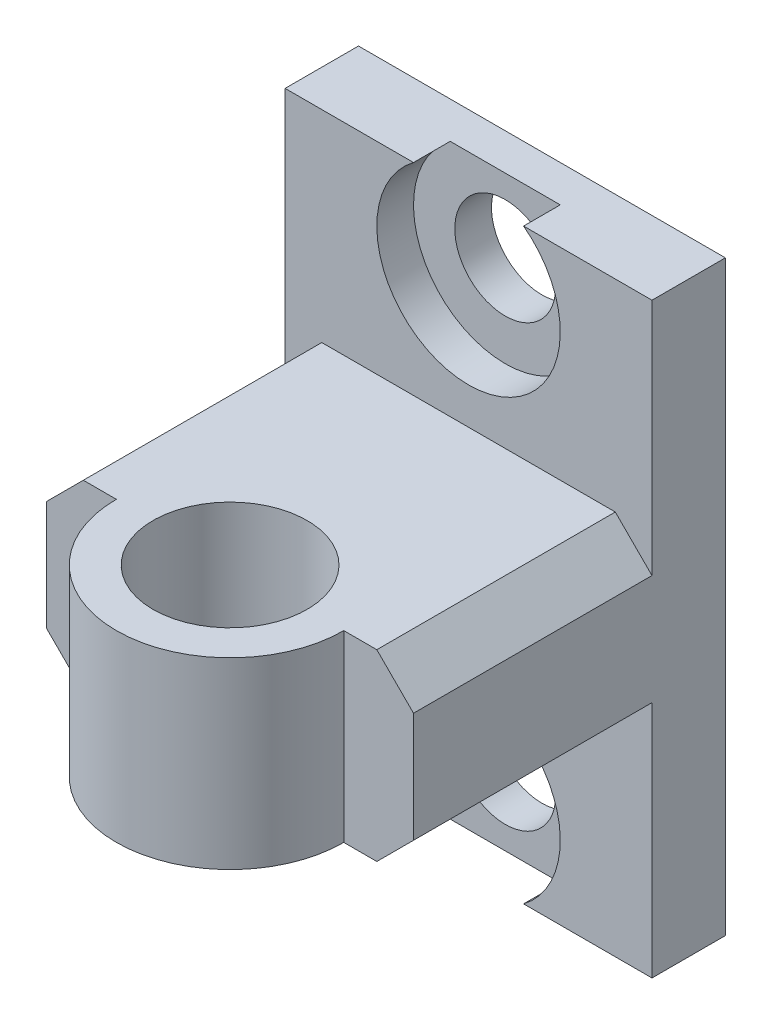
ISO-10303-21;
HEADER;
FILE_DESCRIPTION(('STEP AP214'),'2;1');
FILE_NAME('part.step','',(''),(''),'','','');
FILE_SCHEMA(('AUTOMOTIVE_DESIGN { 1 0 10303 214 1 1 1 1 }'));
ENDSEC;
DATA;
#1=APPLICATION_CONTEXT('core data for automotive mechanical design processes');
#2=APPLICATION_PROTOCOL_DEFINITION('international standard','automotive_design',2000,#1);
#3=PRODUCT_CONTEXT('',#1,'mechanical');
#4=PRODUCT('Part','Part','',(#3));
#5=PRODUCT_RELATED_PRODUCT_CATEGORY('part','',(#4));
#6=PRODUCT_DEFINITION_FORMATION('','',#4);
#7=PRODUCT_DEFINITION_CONTEXT('part definition',#1,'design');
#8=PRODUCT_DEFINITION('design','',#6,#7);
#9=PRODUCT_DEFINITION_SHAPE('','',#8);
#10=(LENGTH_UNIT() NAMED_UNIT(*) SI_UNIT(.MILLI.,.METRE.));
#11=(NAMED_UNIT(*) PLANE_ANGLE_UNIT() SI_UNIT($,.RADIAN.));
#12=(NAMED_UNIT(*) SI_UNIT($,.STERADIAN.) SOLID_ANGLE_UNIT());
#13=UNCERTAINTY_MEASURE_WITH_UNIT(LENGTH_MEASURE(1.E-05),#10,'distance_accuracy_value','');
#14=(GEOMETRIC_REPRESENTATION_CONTEXT(3) GLOBAL_UNCERTAINTY_ASSIGNED_CONTEXT((#13)) GLOBAL_UNIT_ASSIGNED_CONTEXT((#10,
#11,#12)) REPRESENTATION_CONTEXT('',''));
#15=CARTESIAN_POINT('',(0.,0.,0.));
#16=DIRECTION('',(0.,0.,1.));
#17=DIRECTION('',(1.,0.,0.));
#18=AXIS2_PLACEMENT_3D('',#15,#16,#17);
#19=CARTESIAN_POINT('',(10.,-4.,4.));
#20=DIRECTION('',(0.,0.,-1.));
#21=DIRECTION('',(-1.,0.,0.));
#22=AXIS2_PLACEMENT_3D('',#19,#20,#21);
#23=CYLINDRICAL_SURFACE('',#22,2.75);
#24=CARTESIAN_POINT('',(10.,-4.,0.));
#25=DIRECTION('',(0.,0.,1.));
#26=DIRECTION('',(1.,0.,0.));
#27=AXIS2_PLACEMENT_3D('',#24,#25,#26);
#28=CIRCLE('',#27,2.75);
#29=CARTESIAN_POINT('',(12.75,-4.,0.));
#30=VERTEX_POINT('',#29);
#31=EDGE_CURVE('E191',#30,#30,#28,.T.);
#32=ORIENTED_EDGE('',*,*,#31,.F.);
#33=EDGE_LOOP('',(#32));
#34=FACE_BOUND('',#33,.T.);
#35=CARTESIAN_POINT('',(10.,-4.,2.));
#36=DIRECTION('',(0.,0.,1.));
#37=DIRECTION('',(1.,0.,0.));
#38=AXIS2_PLACEMENT_3D('',#35,#36,#37);
#39=CIRCLE('',#38,2.75);
#40=CARTESIAN_POINT('',(12.75,-4.,2.));
#41=VERTEX_POINT('',#40);
#42=EDGE_CURVE('E258',#41,#41,#39,.T.);
#43=ORIENTED_EDGE('',*,*,#42,.T.);
#44=EDGE_LOOP('',(#43));
#45=FACE_BOUND('',#44,.T.);
#46=ADVANCED_FACE('F35',(#34,#45),#23,.F.);
#47=CARTESIAN_POINT('',(10.,-28.,4.));
#48=DIRECTION('',(0.,0.,-1.));
#49=DIRECTION('',(-1.,0.,0.));
#50=AXIS2_PLACEMENT_3D('',#47,#48,#49);
#51=CYLINDRICAL_SURFACE('',#50,2.75);
#52=CARTESIAN_POINT('',(10.,-28.,0.));
#53=DIRECTION('',(0.,0.,1.));
#54=DIRECTION('',(1.,0.,0.));
#55=AXIS2_PLACEMENT_3D('',#52,#53,#54);
#56=CIRCLE('',#55,2.75);
#57=CARTESIAN_POINT('',(12.75,-28.,0.));
#58=VERTEX_POINT('',#57);
#59=EDGE_CURVE('E298',#58,#58,#56,.T.);
#60=ORIENTED_EDGE('',*,*,#59,.F.);
#61=EDGE_LOOP('',(#60));
#62=FACE_BOUND('',#61,.T.);
#63=CARTESIAN_POINT('',(10.,-28.,2.));
#64=DIRECTION('',(0.,0.,1.));
#65=DIRECTION('',(1.,0.,0.));
#66=AXIS2_PLACEMENT_3D('',#63,#64,#65);
#67=CIRCLE('',#66,2.75);
#68=CARTESIAN_POINT('',(12.75,-28.,2.));
#69=VERTEX_POINT('',#68);
#70=EDGE_CURVE('E249',#69,#69,#67,.T.);
#71=ORIENTED_EDGE('',*,*,#70,.T.);
#72=EDGE_LOOP('',(#71));
#73=FACE_BOUND('',#72,.T.);
#74=ADVANCED_FACE('F381',(#62,#73),#51,.F.);
#75=CARTESIAN_POINT('',(0.,0.,17.));
#76=DIRECTION('',(0.,0.,1.));
#77=DIRECTION('',(1.,0.,0.));
#78=AXIS2_PLACEMENT_3D('',#75,#76,#77);
#79=PLANE('',#78);
#80=DIRECTION('',(0.,-1.,0.));
#81=VECTOR('',#80,1.);
#82=CARTESIAN_POINT('',(0.,-11.,17.));
#83=LINE('',#82,#81);
#84=CARTESIAN_POINT('',(0.,-13.,17.));
#85=VERTEX_POINT('',#84);
#86=CARTESIAN_POINT('',(0.,-19.,17.));
#87=VERTEX_POINT('',#86);
#88=EDGE_CURVE('E276',#85,#87,#83,.T.);
#89=ORIENTED_EDGE('',*,*,#88,.T.);
#90=DIRECTION('',(-0.707106781186549,0.707106781186546,0.));
#91=VECTOR('',#90,1.);
#92=CARTESIAN_POINT('',(-9.5,-9.50000000000003,17.));
#93=LINE('',#92,#91);
#94=CARTESIAN_POINT('',(2.00000000000001,-21.,17.));
#95=VERTEX_POINT('',#94);
#96=EDGE_CURVE('E237',#87,#95,#93,.F.);
#97=ORIENTED_EDGE('',*,*,#96,.T.);
#98=DIRECTION('',(1.,0.,0.));
#99=VECTOR('',#98,1.);
#100=CARTESIAN_POINT('',(0.,-21.,17.));
#101=LINE('',#100,#99);
#102=CARTESIAN_POINT('',(3.8,-21.,17.));
#103=VERTEX_POINT('',#102);
#104=EDGE_CURVE('E284',#95,#103,#101,.T.);
#105=ORIENTED_EDGE('',*,*,#104,.T.);
#106=DIRECTION('',(0.,-1.,0.));
#107=VECTOR('',#106,1.);
#108=CARTESIAN_POINT('',(3.8,6.53624817342637,17.));
#109=LINE('',#108,#107);
#110=CARTESIAN_POINT('',(3.8,-11.,17.));
#111=VERTEX_POINT('',#110);
#112=EDGE_CURVE('E208',#111,#103,#109,.T.);
#113=ORIENTED_EDGE('',*,*,#112,.F.);
#114=DIRECTION('',(-1.,0.,0.));
#115=VECTOR('',#114,1.);
#116=CARTESIAN_POINT('',(0.,-11.,17.));
#117=LINE('',#116,#115);
#118=CARTESIAN_POINT('',(2.00000000000001,-11.,17.));
#119=VERTEX_POINT('',#118);
#120=EDGE_CURVE('E295',#111,#119,#117,.T.);
#121=ORIENTED_EDGE('',*,*,#120,.T.);
#122=DIRECTION('',(0.707106781186549,0.707106781186546,0.));
#123=VECTOR('',#122,1.);
#124=CARTESIAN_POINT('',(6.5,-6.50000000000002,17.));
#125=LINE('',#124,#123);
#126=EDGE_CURVE('E235',#119,#85,#125,.F.);
#127=ORIENTED_EDGE('',*,*,#126,.T.);
#128=EDGE_LOOP('',(#89,#97,#105,#113,#121,#127));
#129=FACE_BOUND('',#128,.T.);
#130=ADVANCED_FACE('F387',(#129),#79,.T.);
#131=CARTESIAN_POINT('',(0.,0.,4.));
#132=DIRECTION('',(0.,0.,1.));
#133=DIRECTION('',(1.,0.,0.));
#134=AXIS2_PLACEMENT_3D('',#131,#132,#133);
#135=PLANE('',#134);
#136=CARTESIAN_POINT('',(10.,-4.,4.));
#137=DIRECTION('',(0.,0.,1.));
#138=DIRECTION('',(1.,0.,0.));
#139=AXIS2_PLACEMENT_3D('',#136,#137,#138);
#140=CIRCLE('',#139,5.);
#141=CARTESIAN_POINT('',(7.,0.,4.));
#142=VERTEX_POINT('',#141);
#143=CARTESIAN_POINT('',(13.,0.,4.));
#144=VERTEX_POINT('',#143);
#145=EDGE_CURVE('E159',#142,#144,#140,.T.);
#146=ORIENTED_EDGE('',*,*,#145,.F.);
#147=DIRECTION('',(-1.,0.,0.));
#148=VECTOR('',#147,1.);
#149=CARTESIAN_POINT('',(0.,0.,4.));
#150=LINE('',#149,#148);
#151=CARTESIAN_POINT('',(0.,0.,4.));
#152=VERTEX_POINT('',#151);
#153=EDGE_CURVE('E178',#142,#152,#150,.T.);
#154=ORIENTED_EDGE('',*,*,#153,.T.);
#155=DIRECTION('',(0.,-1.,0.));
#156=VECTOR('',#155,1.);
#157=CARTESIAN_POINT('',(0.,0.,4.));
#158=LINE('',#157,#156);
#159=CARTESIAN_POINT('',(0.,-13.,4.));
#160=VERTEX_POINT('',#159);
#161=EDGE_CURVE('E262',#152,#160,#158,.T.);
#162=ORIENTED_EDGE('',*,*,#161,.T.);
#163=DIRECTION('',(-0.707106781186549,-0.707106781186546,0.));
#164=VECTOR('',#163,1.);
#165=CARTESIAN_POINT('',(0.,-13.,4.));
#166=LINE('',#165,#164);
#167=CARTESIAN_POINT('',(2.00000000000001,-11.,4.));
#168=VERTEX_POINT('',#167);
#169=EDGE_CURVE('E246',#160,#168,#166,.F.);
#170=ORIENTED_EDGE('',*,*,#169,.T.);
#171=DIRECTION('',(-1.,0.,0.));
#172=VECTOR('',#171,1.);
#173=CARTESIAN_POINT('',(0.,-11.,4.));
#174=LINE('',#173,#172);
#175=CARTESIAN_POINT('',(18.,-11.,4.));
#176=VERTEX_POINT('',#175);
#177=EDGE_CURVE('E281',#176,#168,#174,.T.);
#178=ORIENTED_EDGE('',*,*,#177,.F.);
#179=DIRECTION('',(-0.707106781186549,0.707106781186546,0.));
#180=VECTOR('',#179,1.);
#181=CARTESIAN_POINT('',(18.,-11.,4.));
#182=LINE('',#181,#180);
#183=CARTESIAN_POINT('',(20.,-13.,4.));
#184=VERTEX_POINT('',#183);
#185=EDGE_CURVE('E239',#176,#184,#182,.F.);
#186=ORIENTED_EDGE('',*,*,#185,.T.);
#187=DIRECTION('',(0.,1.,0.));
#188=VECTOR('',#187,1.);
#189=CARTESIAN_POINT('',(20.,0.,4.));
#190=LINE('',#189,#188);
#191=CARTESIAN_POINT('',(20.,0.,4.));
#192=VERTEX_POINT('',#191);
#193=EDGE_CURVE('E175',#184,#192,#190,.T.);
#194=ORIENTED_EDGE('',*,*,#193,.T.);
#195=EDGE_CURVE('E171',#192,#144,#150,.T.);
#196=ORIENTED_EDGE('',*,*,#195,.T.);
#197=EDGE_LOOP('',(#146,#154,#162,#170,#178,#186,#194,#196));
#198=FACE_BOUND('',#197,.T.);
#199=ADVANCED_FACE('F173',(#198),#135,.T.);
#200=CARTESIAN_POINT('',(10.,-28.,4.));
#201=DIRECTION('',(0.,0.,1.));
#202=DIRECTION('',(1.,0.,0.));
#203=AXIS2_PLACEMENT_3D('',#200,#201,#202);
#204=CIRCLE('',#203,5.);
#205=CARTESIAN_POINT('',(13.,-32.,4.));
#206=VERTEX_POINT('',#205);
#207=CARTESIAN_POINT('',(7.,-32.,4.));
#208=VERTEX_POINT('',#207);
#209=EDGE_CURVE('E314',#206,#208,#204,.T.);
#210=ORIENTED_EDGE('',*,*,#209,.F.);
#211=DIRECTION('',(1.,0.,0.));
#212=VECTOR('',#211,1.);
#213=CARTESIAN_POINT('',(0.,-32.,4.));
#214=LINE('',#213,#212);
#215=CARTESIAN_POINT('',(20.,-32.,4.));
#216=VERTEX_POINT('',#215);
#217=EDGE_CURVE('E267',#206,#216,#214,.T.);
#218=ORIENTED_EDGE('',*,*,#217,.T.);
#219=CARTESIAN_POINT('',(20.,-19.,4.));
#220=VERTEX_POINT('',#219);
#221=EDGE_CURVE('E183',#216,#220,#190,.T.);
#222=ORIENTED_EDGE('',*,*,#221,.T.);
#223=DIRECTION('',(0.707106781186545,0.70710678118655,0.));
#224=VECTOR('',#223,1.);
#225=CARTESIAN_POINT('',(20.,-19.,4.));
#226=LINE('',#225,#224);
#227=CARTESIAN_POINT('',(18.,-21.,4.));
#228=VERTEX_POINT('',#227);
#229=EDGE_CURVE('E241',#220,#228,#226,.F.);
#230=ORIENTED_EDGE('',*,*,#229,.T.);
#231=DIRECTION('',(1.,0.,0.));
#232=VECTOR('',#231,1.);
#233=CARTESIAN_POINT('',(0.,-21.,4.));
#234=LINE('',#233,#232);
#235=CARTESIAN_POINT('',(2.00000000000001,-21.,4.));
#236=VERTEX_POINT('',#235);
#237=EDGE_CURVE('E286',#236,#228,#234,.T.);
#238=ORIENTED_EDGE('',*,*,#237,.F.);
#239=DIRECTION('',(0.707106781186549,-0.707106781186546,0.));
#240=VECTOR('',#239,1.);
#241=CARTESIAN_POINT('',(2.00000000000001,-21.,4.));
#242=LINE('',#241,#240);
#243=CARTESIAN_POINT('',(0.,-19.,4.));
#244=VERTEX_POINT('',#243);
#245=EDGE_CURVE('E243',#236,#244,#242,.F.);
#246=ORIENTED_EDGE('',*,*,#245,.T.);
#247=CARTESIAN_POINT('',(0.,-32.,4.));
#248=VERTEX_POINT('',#247);
#249=EDGE_CURVE('E196',#244,#248,#158,.T.);
#250=ORIENTED_EDGE('',*,*,#249,.T.);
#251=EDGE_CURVE('E304',#248,#208,#214,.T.);
#252=ORIENTED_EDGE('',*,*,#251,.T.);
#253=EDGE_LOOP('',(#210,#218,#222,#230,#238,#246,#250,#252));
#254=FACE_BOUND('',#253,.T.);
#255=ADVANCED_FACE('F311',(#254),#135,.T.);
#256=CARTESIAN_POINT('',(0.,0.,0.));
#257=DIRECTION('',(0.,0.,1.));
#258=DIRECTION('',(1.,0.,0.));
#259=AXIS2_PLACEMENT_3D('',#256,#257,#258);
#260=PLANE('',#259);
#261=DIRECTION('',(0.,-1.,0.));
#262=VECTOR('',#261,1.);
#263=CARTESIAN_POINT('',(0.,0.,0.));
#264=LINE('',#263,#262);
#265=CARTESIAN_POINT('',(0.,0.,0.));
#266=VERTEX_POINT('',#265);
#267=CARTESIAN_POINT('',(0.,-32.,0.));
#268=VERTEX_POINT('',#267);
#269=EDGE_CURVE('E187',#266,#268,#264,.T.);
#270=ORIENTED_EDGE('',*,*,#269,.F.);
#271=DIRECTION('',(-1.,0.,0.));
#272=VECTOR('',#271,1.);
#273=CARTESIAN_POINT('',(0.,0.,0.));
#274=LINE('',#273,#272);
#275=CARTESIAN_POINT('',(20.,0.,0.));
#276=VERTEX_POINT('',#275);
#277=EDGE_CURVE('E195',#276,#266,#274,.T.);
#278=ORIENTED_EDGE('',*,*,#277,.F.);
#279=DIRECTION('',(0.,1.,0.));
#280=VECTOR('',#279,1.);
#281=CARTESIAN_POINT('',(20.,0.,0.));
#282=LINE('',#281,#280);
#283=CARTESIAN_POINT('',(20.,-32.,0.));
#284=VERTEX_POINT('',#283);
#285=EDGE_CURVE('E193',#284,#276,#282,.T.);
#286=ORIENTED_EDGE('',*,*,#285,.F.);
#287=DIRECTION('',(1.,0.,0.));
#288=VECTOR('',#287,1.);
#289=CARTESIAN_POINT('',(0.,-32.,0.));
#290=LINE('',#289,#288);
#291=EDGE_CURVE('E190',#268,#284,#290,.T.);
#292=ORIENTED_EDGE('',*,*,#291,.F.);
#293=EDGE_LOOP('',(#270,#278,#286,#292));
#294=FACE_BOUND('',#293,.T.);
#295=ORIENTED_EDGE('',*,*,#31,.T.);
#296=EDGE_LOOP('',(#295));
#297=FACE_BOUND('',#296,.T.);
#298=ORIENTED_EDGE('',*,*,#59,.T.);
#299=EDGE_LOOP('',(#298));
#300=FACE_BOUND('',#299,.T.);
#301=ADVANCED_FACE('F340',(#294,#297,#300),#260,.F.);
#302=CARTESIAN_POINT('',(0.,0.,4.));
#303=DIRECTION('',(1.,0.,0.));
#304=DIRECTION('',(0.,0.,-1.));
#305=AXIS2_PLACEMENT_3D('',#302,#303,#304);
#306=PLANE('',#305);
#307=ORIENTED_EDGE('',*,*,#249,.F.);
#308=DIRECTION('',(0.,0.,1.));
#309=VECTOR('',#308,1.);
#310=CARTESIAN_POINT('',(0.,-19.,4.));
#311=LINE('',#310,#309);
#312=EDGE_CURVE('E233',#244,#87,#311,.T.);
#313=ORIENTED_EDGE('',*,*,#312,.T.);
#314=ORIENTED_EDGE('',*,*,#88,.F.);
#315=DIRECTION('',(0.,0.,-1.));
#316=VECTOR('',#315,1.);
#317=CARTESIAN_POINT('',(0.,-13.,4.));
#318=LINE('',#317,#316);
#319=EDGE_CURVE('E230',#85,#160,#318,.T.);
#320=ORIENTED_EDGE('',*,*,#319,.T.);
#321=ORIENTED_EDGE('',*,*,#161,.F.);
#322=DIRECTION('',(0.,0.,-1.));
#323=VECTOR('',#322,1.);
#324=CARTESIAN_POINT('',(0.,0.,4.));
#325=LINE('',#324,#323);
#326=EDGE_CURVE('E177',#152,#266,#325,.T.);
#327=ORIENTED_EDGE('',*,*,#326,.T.);
#328=ORIENTED_EDGE('',*,*,#269,.T.);
#329=DIRECTION('',(0.,0.,-1.));
#330=VECTOR('',#329,1.);
#331=CARTESIAN_POINT('',(0.,-32.,4.));
#332=LINE('',#331,#330);
#333=EDGE_CURVE('E202',#248,#268,#332,.T.);
#334=ORIENTED_EDGE('',*,*,#333,.F.);
#335=EDGE_LOOP('',(#307,#313,#314,#320,#321,#327,#328,#334));
#336=FACE_BOUND('',#335,.T.);
#337=ADVANCED_FACE('F274',(#336),#306,.F.);
#338=CARTESIAN_POINT('',(0.,-32.,4.));
#339=DIRECTION('',(0.,1.,0.));
#340=DIRECTION('',(0.,0.,1.));
#341=AXIS2_PLACEMENT_3D('',#338,#339,#340);
#342=PLANE('',#341);
#343=DIRECTION('',(1.,0.,0.));
#344=VECTOR('',#343,1.);
#345=CARTESIAN_POINT('',(0.,-32.,2.));
#346=LINE('',#345,#344);
#347=CARTESIAN_POINT('',(7.,-32.,2.));
#348=VERTEX_POINT('',#347);
#349=CARTESIAN_POINT('',(13.,-32.,2.));
#350=VERTEX_POINT('',#349);
#351=EDGE_CURVE('E252',#348,#350,#346,.T.);
#352=ORIENTED_EDGE('',*,*,#351,.F.);
#353=DIRECTION('',(0.,0.,1.));
#354=VECTOR('',#353,1.);
#355=CARTESIAN_POINT('',(7.,-32.,2.));
#356=LINE('',#355,#354);
#357=EDGE_CURVE('E255',#348,#208,#356,.T.);
#358=ORIENTED_EDGE('',*,*,#357,.T.);
#359=ORIENTED_EDGE('',*,*,#251,.F.);
#360=ORIENTED_EDGE('',*,*,#333,.T.);
#361=ORIENTED_EDGE('',*,*,#291,.T.);
#362=DIRECTION('',(0.,0.,-1.));
#363=VECTOR('',#362,1.);
#364=CARTESIAN_POINT('',(20.,-32.,4.));
#365=LINE('',#364,#363);
#366=EDGE_CURVE('E199',#216,#284,#365,.T.);
#367=ORIENTED_EDGE('',*,*,#366,.F.);
#368=ORIENTED_EDGE('',*,*,#217,.F.);
#369=DIRECTION('',(0.,0.,1.));
#370=VECTOR('',#369,1.);
#371=CARTESIAN_POINT('',(13.,-32.,2.));
#372=LINE('',#371,#370);
#373=EDGE_CURVE('E248',#206,#350,#372,.F.);
#374=ORIENTED_EDGE('',*,*,#373,.T.);
#375=EDGE_LOOP('',(#352,#358,#359,#360,#361,#367,#368,#374));
#376=FACE_BOUND('',#375,.T.);
#377=ADVANCED_FACE('F317',(#376),#342,.F.);
#378=CARTESIAN_POINT('',(20.,0.,4.));
#379=DIRECTION('',(-1.,0.,0.));
#380=DIRECTION('',(0.,0.,1.));
#381=AXIS2_PLACEMENT_3D('',#378,#379,#380);
#382=PLANE('',#381);
#383=ORIENTED_EDGE('',*,*,#193,.F.);
#384=DIRECTION('',(0.,0.,1.));
#385=VECTOR('',#384,1.);
#386=CARTESIAN_POINT('',(20.,-13.,4.));
#387=LINE('',#386,#385);
#388=CARTESIAN_POINT('',(20.,-13.,17.));
#389=VERTEX_POINT('',#388);
#390=EDGE_CURVE('E219',#184,#389,#387,.T.);
#391=ORIENTED_EDGE('',*,*,#390,.T.);
#392=DIRECTION('',(0.,1.,0.));
#393=VECTOR('',#392,1.);
#394=CARTESIAN_POINT('',(20.,-11.,17.));
#395=LINE('',#394,#393);
#396=CARTESIAN_POINT('',(20.,-19.,17.));
#397=VERTEX_POINT('',#396);
#398=EDGE_CURVE('E292',#397,#389,#395,.T.);
#399=ORIENTED_EDGE('',*,*,#398,.F.);
#400=DIRECTION('',(0.,0.,-1.));
#401=VECTOR('',#400,1.);
#402=CARTESIAN_POINT('',(20.,-19.,4.));
#403=LINE('',#402,#401);
#404=EDGE_CURVE('E216',#397,#220,#403,.T.);
#405=ORIENTED_EDGE('',*,*,#404,.T.);
#406=ORIENTED_EDGE('',*,*,#221,.F.);
#407=ORIENTED_EDGE('',*,*,#366,.T.);
#408=ORIENTED_EDGE('',*,*,#285,.T.);
#409=DIRECTION('',(0.,0.,-1.));
#410=VECTOR('',#409,1.);
#411=CARTESIAN_POINT('',(20.,0.,4.));
#412=LINE('',#411,#410);
#413=EDGE_CURVE('E181',#192,#276,#412,.T.);
#414=ORIENTED_EDGE('',*,*,#413,.F.);
#415=EDGE_LOOP('',(#383,#391,#399,#405,#406,#407,#408,#414));
#416=FACE_BOUND('',#415,.T.);
#417=ADVANCED_FACE('F320',(#416),#382,.F.);
#418=CARTESIAN_POINT('',(0.,0.,4.));
#419=DIRECTION('',(0.,-1.,0.));
#420=DIRECTION('',(0.,0.,-1.));
#421=AXIS2_PLACEMENT_3D('',#418,#419,#420);
#422=PLANE('',#421);
#423=DIRECTION('',(-1.,0.,0.));
#424=VECTOR('',#423,1.);
#425=CARTESIAN_POINT('',(0.,0.,2.));
#426=LINE('',#425,#424);
#427=CARTESIAN_POINT('',(13.,0.,2.));
#428=VERTEX_POINT('',#427);
#429=CARTESIAN_POINT('',(7.,0.,2.));
#430=VERTEX_POINT('',#429);
#431=EDGE_CURVE('E172',#428,#430,#426,.T.);
#432=ORIENTED_EDGE('',*,*,#431,.F.);
#433=DIRECTION('',(0.,0.,1.));
#434=VECTOR('',#433,1.);
#435=CARTESIAN_POINT('',(13.,0.,2.));
#436=LINE('',#435,#434);
#437=EDGE_CURVE('E11',#428,#144,#436,.T.);
#438=ORIENTED_EDGE('',*,*,#437,.T.);
#439=ORIENTED_EDGE('',*,*,#195,.F.);
#440=ORIENTED_EDGE('',*,*,#413,.T.);
#441=ORIENTED_EDGE('',*,*,#277,.T.);
#442=ORIENTED_EDGE('',*,*,#326,.F.);
#443=ORIENTED_EDGE('',*,*,#153,.F.);
#444=DIRECTION('',(0.,0.,1.));
#445=VECTOR('',#444,1.);
#446=CARTESIAN_POINT('',(7.,0.,2.));
#447=LINE('',#446,#445);
#448=EDGE_CURVE('E43',#142,#430,#447,.F.);
#449=ORIENTED_EDGE('',*,*,#448,.T.);
#450=EDGE_LOOP('',(#432,#438,#439,#440,#441,#442,#443,#449));
#451=FACE_BOUND('',#450,.T.);
#452=ADVANCED_FACE('F169',(#451),#422,.F.);
#453=CARTESIAN_POINT('',(0.,-21.,17.));
#454=DIRECTION('',(0.,1.,0.));
#455=DIRECTION('',(0.,0.,1.));
#456=AXIS2_PLACEMENT_3D('',#453,#454,#455);
#457=PLANE('',#456);
#458=CARTESIAN_POINT('',(10.,-21.,17.));
#459=DIRECTION('',(0.,1.,0.));
#460=DIRECTION('',(0.,0.,1.));
#461=AXIS2_PLACEMENT_3D('',#458,#459,#460);
#462=CIRCLE('',#461,4.2);
#463=CARTESIAN_POINT('',(10.,-21.,21.2));
#464=VERTEX_POINT('',#463);
#465=EDGE_CURVE('E358',#464,#464,#462,.T.);
#466=ORIENTED_EDGE('',*,*,#465,.T.);
#467=EDGE_LOOP('',(#466));
#468=FACE_BOUND('',#467,.T.);
#469=ORIENTED_EDGE('',*,*,#237,.T.);
#470=DIRECTION('',(0.,0.,1.));
#471=VECTOR('',#470,1.);
#472=CARTESIAN_POINT('',(18.,-21.,17.));
#473=LINE('',#472,#471);
#474=CARTESIAN_POINT('',(18.,-21.,17.));
#475=VERTEX_POINT('',#474);
#476=EDGE_CURVE('E228',#228,#475,#473,.T.);
#477=ORIENTED_EDGE('',*,*,#476,.T.);
#478=CARTESIAN_POINT('',(16.2,-21.,17.));
#479=VERTEX_POINT('',#478);
#480=EDGE_CURVE('E280',#479,#475,#101,.T.);
#481=ORIENTED_EDGE('',*,*,#480,.F.);
#482=CARTESIAN_POINT('',(10.,-21.,17.));
#483=DIRECTION('',(0.,-1.,0.));
#484=DIRECTION('',(0.,0.,-1.));
#485=AXIS2_PLACEMENT_3D('',#482,#483,#484);
#486=CIRCLE('',#485,6.2);
#487=EDGE_CURVE('E357',#479,#103,#486,.T.);
#488=ORIENTED_EDGE('',*,*,#487,.T.);
#489=ORIENTED_EDGE('',*,*,#104,.F.);
#490=DIRECTION('',(0.,0.,-1.));
#491=VECTOR('',#490,1.);
#492=CARTESIAN_POINT('',(2.00000000000001,-21.,17.));
#493=LINE('',#492,#491);
#494=EDGE_CURVE('E225',#95,#236,#493,.T.);
#495=ORIENTED_EDGE('',*,*,#494,.T.);
#496=EDGE_LOOP('',(#469,#477,#481,#488,#489,#495));
#497=FACE_BOUND('',#496,.T.);
#498=ADVANCED_FACE('F329',(#468,#497),#457,.F.);
#499=CARTESIAN_POINT('',(0.,-11.,17.));
#500=DIRECTION('',(0.,-1.,0.));
#501=DIRECTION('',(0.,0.,-1.));
#502=AXIS2_PLACEMENT_3D('',#499,#500,#501);
#503=PLANE('',#502);
#504=CARTESIAN_POINT('',(10.,-11.,17.));
#505=DIRECTION('',(0.,1.,0.));
#506=DIRECTION('',(0.,0.,1.));
#507=AXIS2_PLACEMENT_3D('',#504,#505,#506);
#508=CIRCLE('',#507,4.2);
#509=CARTESIAN_POINT('',(10.,-11.,21.2));
#510=VERTEX_POINT('',#509);
#511=EDGE_CURVE('E361',#510,#510,#508,.T.);
#512=ORIENTED_EDGE('',*,*,#511,.F.);
#513=EDGE_LOOP('',(#512));
#514=FACE_BOUND('',#513,.T.);
#515=CARTESIAN_POINT('',(18.,-11.,17.));
#516=VERTEX_POINT('',#515);
#517=CARTESIAN_POINT('',(16.2,-11.,17.));
#518=VERTEX_POINT('',#517);
#519=EDGE_CURVE('E296',#516,#518,#117,.T.);
#520=ORIENTED_EDGE('',*,*,#519,.F.);
#521=DIRECTION('',(0.,0.,-1.));
#522=VECTOR('',#521,1.);
#523=CARTESIAN_POINT('',(18.,-11.,17.));
#524=LINE('',#523,#522);
#525=EDGE_CURVE('E213',#516,#176,#524,.T.);
#526=ORIENTED_EDGE('',*,*,#525,.T.);
#527=ORIENTED_EDGE('',*,*,#177,.T.);
#528=DIRECTION('',(0.,0.,1.));
#529=VECTOR('',#528,1.);
#530=CARTESIAN_POINT('',(2.00000000000001,-11.,17.));
#531=LINE('',#530,#529);
#532=EDGE_CURVE('E211',#168,#119,#531,.T.);
#533=ORIENTED_EDGE('',*,*,#532,.T.);
#534=ORIENTED_EDGE('',*,*,#120,.F.);
#535=CARTESIAN_POINT('',(10.,-11.,17.));
#536=DIRECTION('',(0.,-1.,0.));
#537=DIRECTION('',(0.,0.,-1.));
#538=AXIS2_PLACEMENT_3D('',#535,#536,#537);
#539=CIRCLE('',#538,6.2);
#540=EDGE_CURVE('E289',#111,#518,#539,.F.);
#541=ORIENTED_EDGE('',*,*,#540,.T.);
#542=EDGE_LOOP('',(#520,#526,#527,#533,#534,#541));
#543=FACE_BOUND('',#542,.T.);
#544=ADVANCED_FACE('F352',(#514,#543),#503,.F.);
#545=ORIENTED_EDGE('',*,*,#398,.T.);
#546=DIRECTION('',(0.707106781186549,-0.707106781186546,0.));
#547=VECTOR('',#546,1.);
#548=CARTESIAN_POINT('',(3.49999999999997,3.49999999999998,17.));
#549=LINE('',#548,#547);
#550=EDGE_CURVE('E223',#389,#516,#549,.F.);
#551=ORIENTED_EDGE('',*,*,#550,.T.);
#552=ORIENTED_EDGE('',*,*,#519,.T.);
#553=DIRECTION('',(0.,-1.,0.));
#554=VECTOR('',#553,1.);
#555=CARTESIAN_POINT('',(16.2,6.53624817342637,17.));
#556=LINE('',#555,#554);
#557=EDGE_CURVE('E205',#479,#518,#556,.F.);
#558=ORIENTED_EDGE('',*,*,#557,.F.);
#559=ORIENTED_EDGE('',*,*,#480,.T.);
#560=DIRECTION('',(-0.707106781186545,-0.70710678118655,0.));
#561=VECTOR('',#560,1.);
#562=CARTESIAN_POINT('',(19.5000000000001,-19.4999999999999,17.));
#563=LINE('',#562,#561);
#564=EDGE_CURVE('E221',#475,#397,#563,.F.);
#565=ORIENTED_EDGE('',*,*,#564,.T.);
#566=EDGE_LOOP('',(#545,#551,#552,#558,#559,#565));
#567=FACE_BOUND('',#566,.T.);
#568=ADVANCED_FACE('F349',(#567),#79,.T.);
#569=CARTESIAN_POINT('',(10.,6.53624817342637,17.));
#570=DIRECTION('',(0.,-1.,0.));
#571=DIRECTION('',(0.,0.,-1.));
#572=AXIS2_PLACEMENT_3D('',#569,#570,#571);
#573=CYLINDRICAL_SURFACE('',#572,6.2);
#574=ORIENTED_EDGE('',*,*,#540,.F.);
#575=ORIENTED_EDGE('',*,*,#112,.T.);
#576=ORIENTED_EDGE('',*,*,#487,.F.);
#577=ORIENTED_EDGE('',*,*,#557,.T.);
#578=EDGE_LOOP('',(#574,#575,#576,#577));
#579=FACE_BOUND('',#578,.T.);
#580=ADVANCED_FACE('F428',(#579),#573,.T.);
#581=CARTESIAN_POINT('',(10.,-24.,17.));
#582=DIRECTION('',(0.,1.,0.));
#583=DIRECTION('',(0.,0.,1.));
#584=AXIS2_PLACEMENT_3D('',#581,#582,#583);
#585=CYLINDRICAL_SURFACE('',#584,4.2);
#586=CARTESIAN_POINT('',(10.,-11.,21.2));
#587=CARTESIAN_POINT('',(10.,-11.1041666666667,21.2));
#588=CARTESIAN_POINT('',(10.,-11.2083333333333,21.2));
#589=CARTESIAN_POINT('',(10.,-11.4166666666667,21.2));
#590=CARTESIAN_POINT('',(10.,-11.5208333333333,21.2));
#591=CARTESIAN_POINT('',(10.,-11.7291666666667,21.2));
#592=CARTESIAN_POINT('',(10.,-11.8333333333333,21.2));
#593=CARTESIAN_POINT('',(10.,-12.0416666666667,21.2));
#594=CARTESIAN_POINT('',(10.,-12.1458333333333,21.2));
#595=CARTESIAN_POINT('',(10.,-12.3541666666667,21.2));
#596=CARTESIAN_POINT('',(10.,-12.4583333333333,21.2));
#597=CARTESIAN_POINT('',(10.,-12.6666666666667,21.2));
#598=CARTESIAN_POINT('',(10.,-12.7708333333333,21.2));
#599=CARTESIAN_POINT('',(10.,-12.9791666666667,21.2));
#600=CARTESIAN_POINT('',(10.,-13.0833333333333,21.2));
#601=CARTESIAN_POINT('',(10.,-13.2916666666667,21.2));
#602=CARTESIAN_POINT('',(10.,-13.3958333333333,21.2));
#603=CARTESIAN_POINT('',(10.,-13.6041666666667,21.2));
#604=CARTESIAN_POINT('',(10.,-13.7083333333333,21.2));
#605=CARTESIAN_POINT('',(10.,-13.9166666666667,21.2));
#606=CARTESIAN_POINT('',(10.,-14.0208333333333,21.2));
#607=CARTESIAN_POINT('',(10.,-14.2291666666667,21.2));
#608=CARTESIAN_POINT('',(10.,-14.3333333333333,21.2));
#609=CARTESIAN_POINT('',(10.,-14.5416666666667,21.2));
#610=CARTESIAN_POINT('',(10.,-14.6458333333333,21.2));
#611=CARTESIAN_POINT('',(10.,-14.8541666666667,21.2));
#612=CARTESIAN_POINT('',(10.,-14.9583333333333,21.2));
#613=CARTESIAN_POINT('',(10.,-15.1666666666667,21.2));
#614=CARTESIAN_POINT('',(10.,-15.2708333333333,21.2));
#615=CARTESIAN_POINT('',(10.,-15.4791666666667,21.2));
#616=CARTESIAN_POINT('',(10.,-15.5833333333333,21.2));
#617=CARTESIAN_POINT('',(10.,-15.7916666666667,21.2));
#618=CARTESIAN_POINT('',(10.,-15.8958333333333,21.2));
#619=CARTESIAN_POINT('',(10.,-16.1041666666667,21.2));
#620=CARTESIAN_POINT('',(10.,-16.2083333333333,21.2));
#621=CARTESIAN_POINT('',(10.,-16.4166666666667,21.2));
#622=CARTESIAN_POINT('',(10.,-16.5208333333333,21.2));
#623=CARTESIAN_POINT('',(10.,-16.7291666666667,21.2));
#624=CARTESIAN_POINT('',(10.,-16.8333333333333,21.2));
#625=CARTESIAN_POINT('',(10.,-17.0416666666667,21.2));
#626=CARTESIAN_POINT('',(10.,-17.1458333333333,21.2));
#627=CARTESIAN_POINT('',(10.,-17.3541666666667,21.2));
#628=CARTESIAN_POINT('',(10.,-17.4583333333333,21.2));
#629=CARTESIAN_POINT('',(10.,-17.6666666666667,21.2));
#630=CARTESIAN_POINT('',(10.,-17.7708333333333,21.2));
#631=CARTESIAN_POINT('',(10.,-17.9791666666667,21.2));
#632=CARTESIAN_POINT('',(10.,-18.0833333333333,21.2));
#633=CARTESIAN_POINT('',(10.,-18.2916666666667,21.2));
#634=CARTESIAN_POINT('',(10.,-18.3958333333333,21.2));
#635=CARTESIAN_POINT('',(10.,-18.6041666666667,21.2));
#636=CARTESIAN_POINT('',(10.,-18.7083333333333,21.2));
#637=CARTESIAN_POINT('',(10.,-18.9166666666667,21.2));
#638=CARTESIAN_POINT('',(10.,-19.0208333333333,21.2));
#639=CARTESIAN_POINT('',(10.,-19.2291666666667,21.2));
#640=CARTESIAN_POINT('',(10.,-19.3333333333333,21.2));
#641=CARTESIAN_POINT('',(10.,-19.5416666666667,21.2));
#642=CARTESIAN_POINT('',(10.,-19.6458333333333,21.2));
#643=CARTESIAN_POINT('',(10.,-19.8541666666667,21.2));
#644=CARTESIAN_POINT('',(10.,-19.9583333333333,21.2));
#645=CARTESIAN_POINT('',(10.,-20.1666666666667,21.2));
#646=CARTESIAN_POINT('',(10.,-20.2708333333333,21.2));
#647=CARTESIAN_POINT('',(10.,-20.4791666666667,21.2));
#648=CARTESIAN_POINT('',(10.,-20.5833333333333,21.2));
#649=CARTESIAN_POINT('',(10.,-20.7916666666667,21.2));
#650=CARTESIAN_POINT('',(10.,-20.8958333333333,21.2));
#651=CARTESIAN_POINT('',(10.,-21.,21.2));
#652=B_SPLINE_CURVE_WITH_KNOTS('',3,(#586,#587,#588,#589,#590,#591,#592,#593,#594,#595,#596,
#597,#598,#599,#600,#601,#602,#603,#604,#605,#606,#607,#608,#609,#610,#611,#612,#613,#614,#615,
#616,#617,#618,#619,#620,#621,#622,#623,#624,#625,#626,#627,#628,#629,#630,#631,#632,#633,#634,
#635,#636,#637,#638,#639,#640,#641,#642,#643,#644,#645,#646,#647,#648,#649,#650,#651),
.UNSPECIFIED.,.F.,.F.,(4,2,2,2,2,2,2,2,2,2,2,2,2,2,2,2,2,2,2,2,2,2,2,2,2,2,2,2,2,2,2,2,4),(0.,
0.3125,0.625000000000001,0.937500000000001,1.25,1.5625,1.875,2.1875,2.5,2.8125,3.125,3.4375,
3.75,4.0625,4.375,4.6875,5.,5.3125,5.625,5.9375,6.25,6.5625,6.875,7.1875,7.5,7.8125,8.125,
8.4375,8.75,9.0625,9.375,9.6875,10.),.UNSPECIFIED.);
#653=EDGE_CURVE('BSEAM408',#510,#464,#652,.T.);
#654=ORIENTED_EDGE('',*,*,#511,.T.);
#655=ORIENTED_EDGE('',*,*,#465,.F.);
#656=ORIENTED_EDGE('',*,*,#653,.T.);
#657=ORIENTED_EDGE('',*,*,#653,.F.);
#658=EDGE_LOOP('',(#654,#656,#655,#657));
#659=FACE_BOUND('',#658,.T.);
#660=ADVANCED_FACE('F408',(#659),#585,.F.);
#661=CARTESIAN_POINT('',(18.,-11.,17.));
#662=DIRECTION('',(-0.707106781186546,-0.707106781186549,0.));
#663=DIRECTION('',(0.,0.,-1.));
#664=AXIS2_PLACEMENT_3D('',#661,#662,#663);
#665=PLANE('',#664);
#666=ORIENTED_EDGE('',*,*,#550,.F.);
#667=ORIENTED_EDGE('',*,*,#390,.F.);
#668=ORIENTED_EDGE('',*,*,#185,.F.);
#669=ORIENTED_EDGE('',*,*,#525,.F.);
#670=EDGE_LOOP('',(#666,#667,#668,#669));
#671=FACE_BOUND('',#670,.T.);
#672=ADVANCED_FACE('F346',(#671),#665,.F.);
#673=CARTESIAN_POINT('',(20.,-19.,4.));
#674=DIRECTION('',(-0.70710678118655,0.707106781186545,0.));
#675=DIRECTION('',(0.,0.,-1.));
#676=AXIS2_PLACEMENT_3D('',#673,#674,#675);
#677=PLANE('',#676);
#678=ORIENTED_EDGE('',*,*,#564,.F.);
#679=ORIENTED_EDGE('',*,*,#476,.F.);
#680=ORIENTED_EDGE('',*,*,#229,.F.);
#681=ORIENTED_EDGE('',*,*,#404,.F.);
#682=EDGE_LOOP('',(#678,#679,#680,#681));
#683=FACE_BOUND('',#682,.T.);
#684=ADVANCED_FACE('F325',(#683),#677,.F.);
#685=CARTESIAN_POINT('',(2.00000000000001,-21.,17.));
#686=DIRECTION('',(0.707106781186546,0.707106781186549,0.));
#687=DIRECTION('',(0.,0.,-1.));
#688=AXIS2_PLACEMENT_3D('',#685,#686,#687);
#689=PLANE('',#688);
#690=ORIENTED_EDGE('',*,*,#96,.F.);
#691=ORIENTED_EDGE('',*,*,#312,.F.);
#692=ORIENTED_EDGE('',*,*,#245,.F.);
#693=ORIENTED_EDGE('',*,*,#494,.F.);
#694=EDGE_LOOP('',(#690,#691,#692,#693));
#695=FACE_BOUND('',#694,.T.);
#696=ADVANCED_FACE('F335',(#695),#689,.F.);
#697=CARTESIAN_POINT('',(0.,-13.,4.));
#698=DIRECTION('',(0.707106781186546,-0.707106781186549,0.));
#699=DIRECTION('',(0.,0.,-1.));
#700=AXIS2_PLACEMENT_3D('',#697,#698,#699);
#701=PLANE('',#700);
#702=ORIENTED_EDGE('',*,*,#126,.F.);
#703=ORIENTED_EDGE('',*,*,#532,.F.);
#704=ORIENTED_EDGE('',*,*,#169,.F.);
#705=ORIENTED_EDGE('',*,*,#319,.F.);
#706=EDGE_LOOP('',(#702,#703,#704,#705));
#707=FACE_BOUND('',#706,.T.);
#708=ADVANCED_FACE('F37',(#707),#701,.F.);
#709=CARTESIAN_POINT('',(10.,-28.,2.));
#710=DIRECTION('',(0.,0.,1.));
#711=DIRECTION('',(1.,0.,0.));
#712=AXIS2_PLACEMENT_3D('',#709,#710,#711);
#713=CYLINDRICAL_SURFACE('',#712,5.);
#714=CARTESIAN_POINT('',(10.,-28.,2.));
#715=DIRECTION('',(0.,0.,1.));
#716=DIRECTION('',(1.,0.,0.));
#717=AXIS2_PLACEMENT_3D('',#714,#715,#716);
#718=CIRCLE('',#717,5.);
#719=EDGE_CURVE('E56',#350,#348,#718,.T.);
#720=ORIENTED_EDGE('',*,*,#719,.F.);
#721=ORIENTED_EDGE('',*,*,#373,.F.);
#722=ORIENTED_EDGE('',*,*,#209,.T.);
#723=ORIENTED_EDGE('',*,*,#357,.F.);
#724=EDGE_LOOP('',(#720,#721,#722,#723));
#725=FACE_BOUND('',#724,.T.);
#726=ADVANCED_FACE('F414',(#725),#713,.F.);
#727=CARTESIAN_POINT('',(10.,-28.,2.));
#728=DIRECTION('',(0.,0.,1.));
#729=DIRECTION('',(1.,0.,0.));
#730=AXIS2_PLACEMENT_3D('',#727,#728,#729);
#731=PLANE('',#730);
#732=ORIENTED_EDGE('',*,*,#70,.F.);
#733=EDGE_LOOP('',(#732));
#734=FACE_BOUND('',#733,.T.);
#735=ORIENTED_EDGE('',*,*,#351,.T.);
#736=ORIENTED_EDGE('',*,*,#719,.T.);
#737=EDGE_LOOP('',(#735,#736));
#738=FACE_BOUND('',#737,.T.);
#739=ADVANCED_FACE('F377',(#734,#738),#731,.T.);
#740=CARTESIAN_POINT('',(10.,-4.,2.));
#741=DIRECTION('',(0.,0.,1.));
#742=DIRECTION('',(1.,0.,0.));
#743=AXIS2_PLACEMENT_3D('',#740,#741,#742);
#744=CYLINDRICAL_SURFACE('',#743,5.);
#745=CARTESIAN_POINT('',(10.,-4.,2.));
#746=DIRECTION('',(0.,0.,1.));
#747=DIRECTION('',(1.,0.,0.));
#748=AXIS2_PLACEMENT_3D('',#745,#746,#747);
#749=CIRCLE('',#748,5.);
#750=EDGE_CURVE('E49',#430,#428,#749,.T.);
#751=ORIENTED_EDGE('',*,*,#750,.F.);
#752=ORIENTED_EDGE('',*,*,#448,.F.);
#753=ORIENTED_EDGE('',*,*,#145,.T.);
#754=ORIENTED_EDGE('',*,*,#437,.F.);
#755=EDGE_LOOP('',(#751,#752,#753,#754));
#756=FACE_BOUND('',#755,.T.);
#757=ADVANCED_FACE('F160',(#756),#744,.F.);
#758=CARTESIAN_POINT('',(10.,-4.,2.));
#759=DIRECTION('',(0.,0.,1.));
#760=DIRECTION('',(1.,0.,0.));
#761=AXIS2_PLACEMENT_3D('',#758,#759,#760);
#762=PLANE('',#761);
#763=ORIENTED_EDGE('',*,*,#42,.F.);
#764=EDGE_LOOP('',(#763));
#765=FACE_BOUND('',#764,.T.);
#766=ORIENTED_EDGE('',*,*,#431,.T.);
#767=ORIENTED_EDGE('',*,*,#750,.T.);
#768=EDGE_LOOP('',(#766,#767));
#769=FACE_BOUND('',#768,.T.);
#770=ADVANCED_FACE('F370',(#765,#769),#762,.T.);
#771=CLOSED_SHELL('',(#46,#74,#130,#199,#255,#301,#337,#377,#417,#452,#498,#544,#568,#580,#660,
#672,#684,#696,#708,#726,#739,#757,#770));
#772=MANIFOLD_SOLID_BREP('B2',#771);
#773=ADVANCED_BREP_SHAPE_REPRESENTATION('',(#18,#772),#14);
#774=SHAPE_DEFINITION_REPRESENTATION(#9,#773);
ENDSEC;
END-ISO-10303-21;
